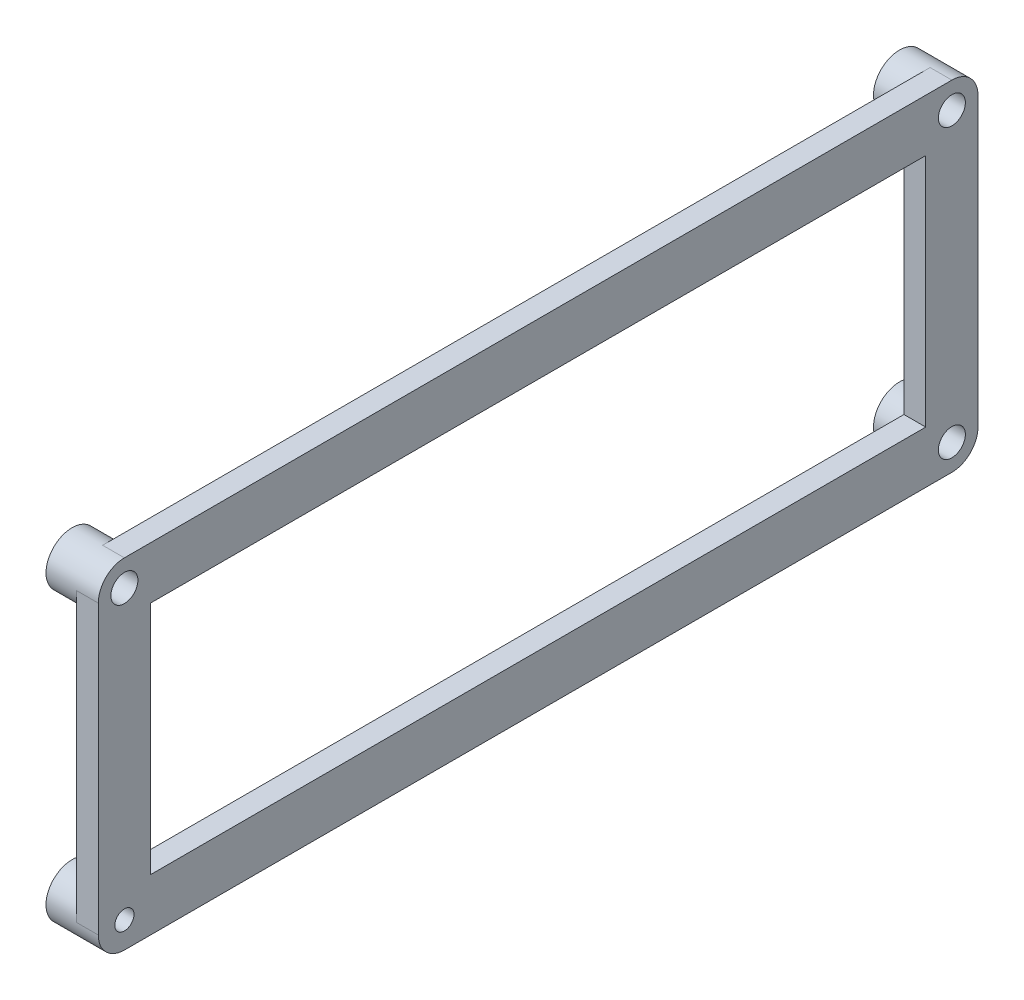
ISO-10303-21;
HEADER;
FILE_DESCRIPTION(('STEP AP214'),'2;1');
FILE_NAME('part.step','',(''),(''),'','','');
FILE_SCHEMA(('AUTOMOTIVE_DESIGN { 1 0 10303 214 1 1 1 1 }'));
ENDSEC;
DATA;
#1=APPLICATION_CONTEXT('core data for automotive mechanical design processes');
#2=APPLICATION_PROTOCOL_DEFINITION('international standard','automotive_design',2000,#1);
#3=PRODUCT_CONTEXT('',#1,'mechanical');
#4=PRODUCT('Part','Part','',(#3));
#5=PRODUCT_RELATED_PRODUCT_CATEGORY('part','',(#4));
#6=PRODUCT_DEFINITION_FORMATION('','',#4);
#7=PRODUCT_DEFINITION_CONTEXT('part definition',#1,'design');
#8=PRODUCT_DEFINITION('design','',#6,#7);
#9=PRODUCT_DEFINITION_SHAPE('','',#8);
#10=(LENGTH_UNIT() NAMED_UNIT(*) SI_UNIT(.MILLI.,.METRE.));
#11=(NAMED_UNIT(*) PLANE_ANGLE_UNIT() SI_UNIT($,.RADIAN.));
#12=(NAMED_UNIT(*) SI_UNIT($,.STERADIAN.) SOLID_ANGLE_UNIT());
#13=UNCERTAINTY_MEASURE_WITH_UNIT(LENGTH_MEASURE(1.E-05),#10,'distance_accuracy_value','');
#14=(GEOMETRIC_REPRESENTATION_CONTEXT(3) GLOBAL_UNCERTAINTY_ASSIGNED_CONTEXT((#13)) GLOBAL_UNIT_ASSIGNED_CONTEXT((#10,
#11,#12)) REPRESENTATION_CONTEXT('',''));
#15=CARTESIAN_POINT('',(0.,0.,0.));
#16=DIRECTION('',(0.,0.,1.));
#17=DIRECTION('',(1.,0.,0.));
#18=AXIS2_PLACEMENT_3D('',#15,#16,#17);
#19=CARTESIAN_POINT('',(6.,0.,0.));
#20=DIRECTION('',(1.,0.,0.));
#21=DIRECTION('',(0.,0.,-1.));
#22=AXIS2_PLACEMENT_3D('',#19,#20,#21);
#23=PLANE('',#22);
#24=DIRECTION('',(0.,0.,-1.));
#25=VECTOR('',#24,1.);
#26=CARTESIAN_POINT('',(6.,-13.5,0.));
#27=LINE('',#26,#25);
#28=CARTESIAN_POINT('',(6.,-13.5,44.5));
#29=VERTEX_POINT('',#28);
#30=CARTESIAN_POINT('',(6.,-13.5,-44.5));
#31=VERTEX_POINT('',#30);
#32=EDGE_CURVE('E134',#29,#31,#27,.T.);
#33=ORIENTED_EDGE('',*,*,#32,.F.);
#34=DIRECTION('',(0.,-1.,0.));
#35=VECTOR('',#34,1.);
#36=CARTESIAN_POINT('',(6.,0.,44.5));
#37=LINE('',#36,#35);
#38=CARTESIAN_POINT('',(6.,13.5,44.5));
#39=VERTEX_POINT('',#38);
#40=EDGE_CURVE('E124',#39,#29,#37,.T.);
#41=ORIENTED_EDGE('',*,*,#40,.F.);
#42=DIRECTION('',(0.,0.,-1.));
#43=VECTOR('',#42,1.);
#44=CARTESIAN_POINT('',(6.,13.5,0.));
#45=LINE('',#44,#43);
#46=CARTESIAN_POINT('',(6.,13.5,-44.5));
#47=VERTEX_POINT('',#46);
#48=EDGE_CURVE('E135',#39,#47,#45,.T.);
#49=ORIENTED_EDGE('',*,*,#48,.T.);
#50=DIRECTION('',(0.,-1.,0.));
#51=VECTOR('',#50,1.);
#52=CARTESIAN_POINT('',(6.,0.,-44.5));
#53=LINE('',#52,#51);
#54=EDGE_CURVE('E139',#47,#31,#53,.T.);
#55=ORIENTED_EDGE('',*,*,#54,.T.);
#56=EDGE_LOOP('',(#33,#41,#49,#55));
#57=FACE_BOUND('',#56,.T.);
#58=CARTESIAN_POINT('',(6.,16.5,47.5));
#59=DIRECTION('',(1.,0.,0.));
#60=DIRECTION('',(0.,0.,-1.));
#61=AXIS2_PLACEMENT_3D('',#58,#59,#60);
#62=CIRCLE('',#61,3.);
#63=CARTESIAN_POINT('',(6.,19.5,47.5));
#64=VERTEX_POINT('',#63);
#65=CARTESIAN_POINT('',(6.,16.5,50.5));
#66=VERTEX_POINT('',#65);
#67=EDGE_CURVE('E196',#64,#66,#62,.T.);
#68=ORIENTED_EDGE('',*,*,#67,.T.);
#69=DIRECTION('',(0.,-1.,0.));
#70=VECTOR('',#69,1.);
#71=CARTESIAN_POINT('',(6.,0.,50.5));
#72=LINE('',#71,#70);
#73=CARTESIAN_POINT('',(6.,-16.5,50.5));
#74=VERTEX_POINT('',#73);
#75=EDGE_CURVE('E142',#66,#74,#72,.T.);
#76=ORIENTED_EDGE('',*,*,#75,.T.);
#77=CARTESIAN_POINT('',(6.,-16.5,47.5));
#78=DIRECTION('',(1.,0.,0.));
#79=DIRECTION('',(0.,0.,-1.));
#80=AXIS2_PLACEMENT_3D('',#77,#78,#79);
#81=CIRCLE('',#80,3.);
#82=CARTESIAN_POINT('',(6.,-19.5,47.5));
#83=VERTEX_POINT('',#82);
#84=EDGE_CURVE('E168',#74,#83,#81,.T.);
#85=ORIENTED_EDGE('',*,*,#84,.T.);
#86=DIRECTION('',(0.,0.,-1.));
#87=VECTOR('',#86,1.);
#88=CARTESIAN_POINT('',(6.,-19.5,0.));
#89=LINE('',#88,#87);
#90=CARTESIAN_POINT('',(6.,-19.5,-47.5));
#91=VERTEX_POINT('',#90);
#92=EDGE_CURVE('E209',#83,#91,#89,.T.);
#93=ORIENTED_EDGE('',*,*,#92,.T.);
#94=CARTESIAN_POINT('',(6.,-16.5,-47.5));
#95=DIRECTION('',(1.,0.,0.));
#96=DIRECTION('',(0.,0.,-1.));
#97=AXIS2_PLACEMENT_3D('',#94,#95,#96);
#98=CIRCLE('',#97,3.);
#99=CARTESIAN_POINT('',(6.,-16.5,-50.5));
#100=VERTEX_POINT('',#99);
#101=EDGE_CURVE('E206',#91,#100,#98,.T.);
#102=ORIENTED_EDGE('',*,*,#101,.T.);
#103=DIRECTION('',(0.,-1.,0.));
#104=VECTOR('',#103,1.);
#105=CARTESIAN_POINT('',(6.,0.,-50.5));
#106=LINE('',#105,#104);
#107=CARTESIAN_POINT('',(6.,16.5,-50.5));
#108=VERTEX_POINT('',#107);
#109=EDGE_CURVE('E204',#108,#100,#106,.T.);
#110=ORIENTED_EDGE('',*,*,#109,.F.);
#111=CARTESIAN_POINT('',(6.,16.5,-47.5));
#112=DIRECTION('',(1.,0.,0.));
#113=DIRECTION('',(0.,0.,-1.));
#114=AXIS2_PLACEMENT_3D('',#111,#112,#113);
#115=CIRCLE('',#114,3.);
#116=CARTESIAN_POINT('',(6.,19.5,-47.5));
#117=VERTEX_POINT('',#116);
#118=EDGE_CURVE('E202',#108,#117,#115,.T.);
#119=ORIENTED_EDGE('',*,*,#118,.T.);
#120=DIRECTION('',(0.,0.,-1.));
#121=VECTOR('',#120,1.);
#122=CARTESIAN_POINT('',(6.,19.5,0.));
#123=LINE('',#122,#121);
#124=EDGE_CURVE('E199',#64,#117,#123,.T.);
#125=ORIENTED_EDGE('',*,*,#124,.F.);
#126=EDGE_LOOP('',(#68,#76,#85,#93,#102,#110,#119,#125));
#127=FACE_BOUND('',#126,.T.);
#128=CARTESIAN_POINT('',(6.,16.5,47.5));
#129=DIRECTION('',(1.,0.,0.));
#130=DIRECTION('',(0.,0.,-1.));
#131=AXIS2_PLACEMENT_3D('',#128,#129,#130);
#132=CIRCLE('',#131,1.55);
#133=CARTESIAN_POINT('',(6.,16.5,45.95));
#134=VERTEX_POINT('',#133);
#135=EDGE_CURVE('E190',#134,#134,#132,.F.);
#136=ORIENTED_EDGE('',*,*,#135,.T.);
#137=EDGE_LOOP('',(#136));
#138=FACE_BOUND('',#137,.T.);
#139=CARTESIAN_POINT('',(6.,16.5,-47.5));
#140=DIRECTION('',(1.,0.,0.));
#141=DIRECTION('',(0.,0.,-1.));
#142=AXIS2_PLACEMENT_3D('',#139,#140,#141);
#143=CIRCLE('',#142,1.55);
#144=CARTESIAN_POINT('',(6.,16.5,-49.05));
#145=VERTEX_POINT('',#144);
#146=EDGE_CURVE('E187',#145,#145,#143,.T.);
#147=ORIENTED_EDGE('',*,*,#146,.F.);
#148=EDGE_LOOP('',(#147));
#149=FACE_BOUND('',#148,.T.);
#150=CARTESIAN_POINT('',(6.,-16.5,-47.5));
#151=DIRECTION('',(1.,0.,0.));
#152=DIRECTION('',(0.,0.,-1.));
#153=AXIS2_PLACEMENT_3D('',#150,#151,#152);
#154=CIRCLE('',#153,1.55);
#155=CARTESIAN_POINT('',(6.,-16.5,-49.05));
#156=VERTEX_POINT('',#155);
#157=EDGE_CURVE('E184',#156,#156,#154,.T.);
#158=ORIENTED_EDGE('',*,*,#157,.F.);
#159=EDGE_LOOP('',(#158));
#160=FACE_BOUND('',#159,.T.);
#161=CARTESIAN_POINT('',(6.,-16.5,47.5));
#162=DIRECTION('',(1.,0.,0.));
#163=DIRECTION('',(0.,0.,-1.));
#164=AXIS2_PLACEMENT_3D('',#161,#162,#163);
#165=CIRCLE('',#164,1.1);
#166=CARTESIAN_POINT('',(6.,-16.5,46.4));
#167=VERTEX_POINT('',#166);
#168=EDGE_CURVE('E328',#167,#167,#165,.F.);
#169=ORIENTED_EDGE('',*,*,#168,.T.);
#170=EDGE_LOOP('',(#169));
#171=FACE_BOUND('',#170,.T.);
#172=ADVANCED_FACE('F36',(#57,#127,#138,#149,#160,#171),#23,.T.);
#173=CARTESIAN_POINT('',(6.,0.,50.5));
#174=DIRECTION('',(0.,0.,-1.));
#175=DIRECTION('',(-1.,0.,0.));
#176=AXIS2_PLACEMENT_3D('',#173,#174,#175);
#177=PLANE('',#176);
#178=ORIENTED_EDGE('',*,*,#75,.F.);
#179=DIRECTION('',(-1.,0.,0.));
#180=VECTOR('',#179,1.);
#181=CARTESIAN_POINT('',(6.,16.5,50.5));
#182=LINE('',#181,#180);
#183=CARTESIAN_POINT('',(3.5,16.5,50.5));
#184=VERTEX_POINT('',#183);
#185=EDGE_CURVE('E352',#66,#184,#182,.T.);
#186=ORIENTED_EDGE('',*,*,#185,.T.);
#187=DIRECTION('',(0.,-1.,0.));
#188=VECTOR('',#187,1.);
#189=CARTESIAN_POINT('',(3.5,0.,50.5));
#190=LINE('',#189,#188);
#191=CARTESIAN_POINT('',(3.5,-16.5,50.5));
#192=VERTEX_POINT('',#191);
#193=EDGE_CURVE('E174',#184,#192,#190,.T.);
#194=ORIENTED_EDGE('',*,*,#193,.T.);
#195=DIRECTION('',(-1.,0.,0.));
#196=VECTOR('',#195,1.);
#197=CARTESIAN_POINT('',(6.,-16.5,50.5));
#198=LINE('',#197,#196);
#199=EDGE_CURVE('E156',#74,#192,#198,.T.);
#200=ORIENTED_EDGE('',*,*,#199,.F.);
#201=EDGE_LOOP('',(#178,#186,#194,#200));
#202=FACE_BOUND('',#201,.T.);
#203=ADVANCED_FACE('F253',(#202),#177,.F.);
#204=CARTESIAN_POINT('',(6.,0.,44.5));
#205=DIRECTION('',(0.,0.,-1.));
#206=DIRECTION('',(-1.,0.,0.));
#207=AXIS2_PLACEMENT_3D('',#204,#205,#206);
#208=PLANE('',#207);
#209=ORIENTED_EDGE('',*,*,#40,.T.);
#210=DIRECTION('',(-1.,0.,0.));
#211=VECTOR('',#210,1.);
#212=CARTESIAN_POINT('',(6.,-13.5,44.5));
#213=LINE('',#212,#211);
#214=CARTESIAN_POINT('',(3.5,-13.5,44.5));
#215=VERTEX_POINT('',#214);
#216=EDGE_CURVE('E128',#29,#215,#213,.T.);
#217=ORIENTED_EDGE('',*,*,#216,.T.);
#218=DIRECTION('',(0.,-1.,0.));
#219=VECTOR('',#218,1.);
#220=CARTESIAN_POINT('',(3.5,0.,44.5));
#221=LINE('',#220,#219);
#222=CARTESIAN_POINT('',(3.5,13.5,44.5));
#223=VERTEX_POINT('',#222);
#224=EDGE_CURVE('E171',#223,#215,#221,.T.);
#225=ORIENTED_EDGE('',*,*,#224,.F.);
#226=DIRECTION('',(-1.,0.,0.));
#227=VECTOR('',#226,1.);
#228=CARTESIAN_POINT('',(6.,13.5,44.5));
#229=LINE('',#228,#227);
#230=EDGE_CURVE('E130',#39,#223,#229,.T.);
#231=ORIENTED_EDGE('',*,*,#230,.F.);
#232=EDGE_LOOP('',(#209,#217,#225,#231));
#233=FACE_BOUND('',#232,.T.);
#234=ADVANCED_FACE('F38',(#233),#208,.T.);
#235=CARTESIAN_POINT('',(6.,0.,-50.5));
#236=DIRECTION('',(0.,0.,-1.));
#237=DIRECTION('',(-1.,0.,0.));
#238=AXIS2_PLACEMENT_3D('',#235,#236,#237);
#239=PLANE('',#238);
#240=DIRECTION('',(-1.,0.,0.));
#241=VECTOR('',#240,1.);
#242=CARTESIAN_POINT('',(6.,16.5,-50.5));
#243=LINE('',#242,#241);
#244=CARTESIAN_POINT('',(3.5,16.5,-50.5));
#245=VERTEX_POINT('',#244);
#246=EDGE_CURVE('E345',#108,#245,#243,.T.);
#247=ORIENTED_EDGE('',*,*,#246,.F.);
#248=ORIENTED_EDGE('',*,*,#109,.T.);
#249=DIRECTION('',(-1.,0.,0.));
#250=VECTOR('',#249,1.);
#251=CARTESIAN_POINT('',(6.,-16.5,-50.5));
#252=LINE('',#251,#250);
#253=CARTESIAN_POINT('',(3.5,-16.5,-50.5));
#254=VERTEX_POINT('',#253);
#255=EDGE_CURVE('E342',#100,#254,#252,.T.);
#256=ORIENTED_EDGE('',*,*,#255,.T.);
#257=DIRECTION('',(0.,-1.,0.));
#258=VECTOR('',#257,1.);
#259=CARTESIAN_POINT('',(3.5,0.,-50.5));
#260=LINE('',#259,#258);
#261=EDGE_CURVE('E179',#245,#254,#260,.T.);
#262=ORIENTED_EDGE('',*,*,#261,.F.);
#263=EDGE_LOOP('',(#247,#248,#256,#262));
#264=FACE_BOUND('',#263,.T.);
#265=ADVANCED_FACE('F260',(#264),#239,.T.);
#266=CARTESIAN_POINT('',(6.,0.,-44.5));
#267=DIRECTION('',(0.,0.,-1.));
#268=DIRECTION('',(-1.,0.,0.));
#269=AXIS2_PLACEMENT_3D('',#266,#267,#268);
#270=PLANE('',#269);
#271=DIRECTION('',(-1.,0.,0.));
#272=VECTOR('',#271,1.);
#273=CARTESIAN_POINT('',(6.,-13.5,-44.5));
#274=LINE('',#273,#272);
#275=CARTESIAN_POINT('',(3.5,-13.5,-44.5));
#276=VERTEX_POINT('',#275);
#277=EDGE_CURVE('E161',#31,#276,#274,.T.);
#278=ORIENTED_EDGE('',*,*,#277,.F.);
#279=ORIENTED_EDGE('',*,*,#54,.F.);
#280=DIRECTION('',(-1.,0.,0.));
#281=VECTOR('',#280,1.);
#282=CARTESIAN_POINT('',(6.,13.5,-44.5));
#283=LINE('',#282,#281);
#284=CARTESIAN_POINT('',(3.5,13.5,-44.5));
#285=VERTEX_POINT('',#284);
#286=EDGE_CURVE('E150',#47,#285,#283,.T.);
#287=ORIENTED_EDGE('',*,*,#286,.T.);
#288=DIRECTION('',(0.,-1.,0.));
#289=VECTOR('',#288,1.);
#290=CARTESIAN_POINT('',(3.5,0.,-44.5));
#291=LINE('',#290,#289);
#292=EDGE_CURVE('E164',#285,#276,#291,.T.);
#293=ORIENTED_EDGE('',*,*,#292,.T.);
#294=EDGE_LOOP('',(#278,#279,#287,#293));
#295=FACE_BOUND('',#294,.T.);
#296=ADVANCED_FACE('F263',(#295),#270,.F.);
#297=CARTESIAN_POINT('',(3.5,0.,0.));
#298=DIRECTION('',(1.,0.,0.));
#299=DIRECTION('',(0.,0.,-1.));
#300=AXIS2_PLACEMENT_3D('',#297,#298,#299);
#301=PLANE('',#300);
#302=DIRECTION('',(0.,0.,-1.));
#303=VECTOR('',#302,1.);
#304=CARTESIAN_POINT('',(3.5,-13.5,0.));
#305=LINE('',#304,#303);
#306=EDGE_CURVE('E146',#215,#276,#305,.T.);
#307=ORIENTED_EDGE('',*,*,#306,.T.);
#308=ORIENTED_EDGE('',*,*,#292,.F.);
#309=DIRECTION('',(0.,0.,-1.));
#310=VECTOR('',#309,1.);
#311=CARTESIAN_POINT('',(3.5,13.5,0.));
#312=LINE('',#311,#310);
#313=EDGE_CURVE('E167',#223,#285,#312,.T.);
#314=ORIENTED_EDGE('',*,*,#313,.F.);
#315=ORIENTED_EDGE('',*,*,#224,.T.);
#316=EDGE_LOOP('',(#307,#308,#314,#315));
#317=FACE_BOUND('',#316,.T.);
#318=CARTESIAN_POINT('',(3.5,16.5,-47.5));
#319=DIRECTION('',(1.,0.,0.));
#320=DIRECTION('',(0.,0.,-1.));
#321=AXIS2_PLACEMENT_3D('',#318,#319,#320);
#322=CIRCLE('',#321,3.);
#323=CARTESIAN_POINT('',(3.5,19.5,-47.5));
#324=VERTEX_POINT('',#323);
#325=EDGE_CURVE('E51',#324,#245,#322,.T.);
#326=ORIENTED_EDGE('',*,*,#325,.T.);
#327=ORIENTED_EDGE('',*,*,#261,.T.);
#328=CARTESIAN_POINT('',(3.5,-16.5,-47.5));
#329=DIRECTION('',(1.,0.,0.));
#330=DIRECTION('',(0.,0.,-1.));
#331=AXIS2_PLACEMENT_3D('',#328,#329,#330);
#332=CIRCLE('',#331,3.);
#333=CARTESIAN_POINT('',(3.5,-19.5,-47.5));
#334=VERTEX_POINT('',#333);
#335=EDGE_CURVE('E57',#254,#334,#332,.T.);
#336=ORIENTED_EDGE('',*,*,#335,.T.);
#337=DIRECTION('',(0.,0.,-1.));
#338=VECTOR('',#337,1.);
#339=CARTESIAN_POINT('',(3.5,-19.5,0.));
#340=LINE('',#339,#338);
#341=CARTESIAN_POINT('',(3.5,-19.5,47.5));
#342=VERTEX_POINT('',#341);
#343=EDGE_CURVE('E181',#342,#334,#340,.T.);
#344=ORIENTED_EDGE('',*,*,#343,.F.);
#345=CARTESIAN_POINT('',(3.5,-16.5,47.5));
#346=DIRECTION('',(1.,0.,0.));
#347=DIRECTION('',(0.,0.,-1.));
#348=AXIS2_PLACEMENT_3D('',#345,#346,#347);
#349=CIRCLE('',#348,3.);
#350=EDGE_CURVE('E183',#342,#192,#349,.T.);
#351=ORIENTED_EDGE('',*,*,#350,.T.);
#352=ORIENTED_EDGE('',*,*,#193,.F.);
#353=CARTESIAN_POINT('',(3.5,16.5,47.5));
#354=DIRECTION('',(1.,0.,0.));
#355=DIRECTION('',(0.,0.,-1.));
#356=AXIS2_PLACEMENT_3D('',#353,#354,#355);
#357=CIRCLE('',#356,3.);
#358=CARTESIAN_POINT('',(3.5,19.5,47.5));
#359=VERTEX_POINT('',#358);
#360=EDGE_CURVE('E330',#184,#359,#357,.T.);
#361=ORIENTED_EDGE('',*,*,#360,.T.);
#362=DIRECTION('',(0.,0.,-1.));
#363=VECTOR('',#362,1.);
#364=CARTESIAN_POINT('',(3.5,19.5,0.));
#365=LINE('',#364,#363);
#366=EDGE_CURVE('E177',#359,#324,#365,.T.);
#367=ORIENTED_EDGE('',*,*,#366,.T.);
#368=EDGE_LOOP('',(#326,#327,#336,#344,#351,#352,#361,#367));
#369=FACE_BOUND('',#368,.T.);
#370=ADVANCED_FACE('F266',(#317,#369),#301,.F.);
#371=CARTESIAN_POINT('',(0.,16.5,47.5));
#372=DIRECTION('',(1.,0.,0.));
#373=DIRECTION('',(0.,0.,-1.));
#374=AXIS2_PLACEMENT_3D('',#371,#372,#373);
#375=PLANE('',#374);
#376=CARTESIAN_POINT('',(0.,16.5,47.5));
#377=DIRECTION('',(1.,0.,0.));
#378=DIRECTION('',(0.,0.,-1.));
#379=AXIS2_PLACEMENT_3D('',#376,#377,#378);
#380=CIRCLE('',#379,3.);
#381=CARTESIAN_POINT('',(0.,16.5,44.5));
#382=VERTEX_POINT('',#381);
#383=EDGE_CURVE('E153',#382,#382,#380,.T.);
#384=ORIENTED_EDGE('',*,*,#383,.F.);
#385=EDGE_LOOP('',(#384));
#386=FACE_BOUND('',#385,.T.);
#387=CARTESIAN_POINT('',(0.,16.5,47.5));
#388=DIRECTION('',(1.,0.,0.));
#389=DIRECTION('',(0.,0.,-1.));
#390=AXIS2_PLACEMENT_3D('',#387,#388,#389);
#391=CIRCLE('',#390,1.55);
#392=CARTESIAN_POINT('',(0.,16.5,45.95));
#393=VERTEX_POINT('',#392);
#394=EDGE_CURVE('E148',#393,#393,#391,.T.);
#395=ORIENTED_EDGE('',*,*,#394,.T.);
#396=EDGE_LOOP('',(#395));
#397=FACE_BOUND('',#396,.T.);
#398=ADVANCED_FACE('F275',(#386,#397),#375,.F.);
#399=CARTESIAN_POINT('',(3.5,16.5,47.5));
#400=DIRECTION('',(-1.,0.,0.));
#401=DIRECTION('',(0.,0.,1.));
#402=AXIS2_PLACEMENT_3D('',#399,#400,#401);
#403=CYLINDRICAL_SURFACE('',#402,3.);
#404=ORIENTED_EDGE('',*,*,#360,.F.);
#405=ORIENTED_EDGE('',*,*,#185,.F.);
#406=ORIENTED_EDGE('',*,*,#67,.F.);
#407=DIRECTION('',(-1.,0.,0.));
#408=VECTOR('',#407,1.);
#409=CARTESIAN_POINT('',(6.,19.5,47.5));
#410=LINE('',#409,#408);
#411=EDGE_CURVE('E350',#64,#359,#410,.T.);
#412=ORIENTED_EDGE('',*,*,#411,.T.);
#413=EDGE_LOOP('',(#404,#405,#406,#412));
#414=FACE_BOUND('',#413,.T.);
#415=ORIENTED_EDGE('',*,*,#383,.T.);
#416=EDGE_LOOP('',(#415));
#417=FACE_BOUND('',#416,.T.);
#418=ADVANCED_FACE('F280',(#414,#417),#403,.T.);
#419=CARTESIAN_POINT('',(3.5,16.5,47.5));
#420=DIRECTION('',(-1.,0.,0.));
#421=DIRECTION('',(0.,0.,1.));
#422=AXIS2_PLACEMENT_3D('',#419,#420,#421);
#423=CYLINDRICAL_SURFACE('',#422,1.55);
#424=ORIENTED_EDGE('',*,*,#394,.F.);
#425=EDGE_LOOP('',(#424));
#426=FACE_BOUND('',#425,.T.);
#427=ORIENTED_EDGE('',*,*,#135,.F.);
#428=EDGE_LOOP('',(#427));
#429=FACE_BOUND('',#428,.T.);
#430=ADVANCED_FACE('F296',(#426,#429),#423,.F.);
#431=CARTESIAN_POINT('',(6.,-13.5,0.));
#432=DIRECTION('',(0.,1.,0.));
#433=DIRECTION('',(0.,0.,1.));
#434=AXIS2_PLACEMENT_3D('',#431,#432,#433);
#435=PLANE('',#434);
#436=ORIENTED_EDGE('',*,*,#306,.F.);
#437=ORIENTED_EDGE('',*,*,#216,.F.);
#438=ORIENTED_EDGE('',*,*,#32,.T.);
#439=ORIENTED_EDGE('',*,*,#277,.T.);
#440=EDGE_LOOP('',(#436,#437,#438,#439));
#441=FACE_BOUND('',#440,.T.);
#442=ADVANCED_FACE('F144',(#441),#435,.T.);
#443=CARTESIAN_POINT('',(6.,13.5,0.));
#444=DIRECTION('',(0.,1.,0.));
#445=DIRECTION('',(0.,0.,1.));
#446=AXIS2_PLACEMENT_3D('',#443,#444,#445);
#447=PLANE('',#446);
#448=ORIENTED_EDGE('',*,*,#313,.T.);
#449=ORIENTED_EDGE('',*,*,#286,.F.);
#450=ORIENTED_EDGE('',*,*,#48,.F.);
#451=ORIENTED_EDGE('',*,*,#230,.T.);
#452=EDGE_LOOP('',(#448,#449,#450,#451));
#453=FACE_BOUND('',#452,.T.);
#454=ADVANCED_FACE('F286',(#453),#447,.F.);
#455=CARTESIAN_POINT('',(6.,-16.5,47.5));
#456=DIRECTION('',(-1.,0.,0.));
#457=DIRECTION('',(0.,0.,1.));
#458=AXIS2_PLACEMENT_3D('',#455,#456,#457);
#459=CYLINDRICAL_SURFACE('',#458,3.);
#460=ORIENTED_EDGE('',*,*,#199,.T.);
#461=ORIENTED_EDGE('',*,*,#350,.F.);
#462=DIRECTION('',(-1.,0.,0.));
#463=VECTOR('',#462,1.);
#464=CARTESIAN_POINT('',(6.,-19.5,47.5));
#465=LINE('',#464,#463);
#466=EDGE_CURVE('E163',#83,#342,#465,.T.);
#467=ORIENTED_EDGE('',*,*,#466,.F.);
#468=ORIENTED_EDGE('',*,*,#84,.F.);
#469=EDGE_LOOP('',(#460,#461,#467,#468));
#470=FACE_BOUND('',#469,.T.);
#471=CARTESIAN_POINT('',(0.,-16.5,47.5));
#472=DIRECTION('',(1.,0.,0.));
#473=DIRECTION('',(0.,0.,-1.));
#474=AXIS2_PLACEMENT_3D('',#471,#472,#473);
#475=CIRCLE('',#474,3.);
#476=CARTESIAN_POINT('',(0.,-16.5,44.5));
#477=VERTEX_POINT('',#476);
#478=EDGE_CURVE('E213',#477,#477,#475,.T.);
#479=ORIENTED_EDGE('',*,*,#478,.T.);
#480=EDGE_LOOP('',(#479));
#481=FACE_BOUND('',#480,.T.);
#482=ADVANCED_FACE('F288',(#470,#481),#459,.T.);
#483=CARTESIAN_POINT('',(6.,-19.5,0.));
#484=DIRECTION('',(0.,1.,0.));
#485=DIRECTION('',(0.,0.,1.));
#486=AXIS2_PLACEMENT_3D('',#483,#484,#485);
#487=PLANE('',#486);
#488=ORIENTED_EDGE('',*,*,#343,.T.);
#489=DIRECTION('',(-1.,0.,0.));
#490=VECTOR('',#489,1.);
#491=CARTESIAN_POINT('',(6.,-19.5,-47.5));
#492=LINE('',#491,#490);
#493=EDGE_CURVE('E339',#91,#334,#492,.T.);
#494=ORIENTED_EDGE('',*,*,#493,.F.);
#495=ORIENTED_EDGE('',*,*,#92,.F.);
#496=ORIENTED_EDGE('',*,*,#466,.T.);
#497=EDGE_LOOP('',(#488,#494,#495,#496));
#498=FACE_BOUND('',#497,.T.);
#499=ADVANCED_FACE('F293',(#498),#487,.F.);
#500=CARTESIAN_POINT('',(6.,-16.5,-47.5));
#501=DIRECTION('',(-1.,0.,0.));
#502=DIRECTION('',(0.,0.,1.));
#503=AXIS2_PLACEMENT_3D('',#500,#501,#502);
#504=CYLINDRICAL_SURFACE('',#503,3.);
#505=ORIENTED_EDGE('',*,*,#493,.T.);
#506=ORIENTED_EDGE('',*,*,#335,.F.);
#507=ORIENTED_EDGE('',*,*,#255,.F.);
#508=ORIENTED_EDGE('',*,*,#101,.F.);
#509=EDGE_LOOP('',(#505,#506,#507,#508));
#510=FACE_BOUND('',#509,.T.);
#511=CARTESIAN_POINT('',(0.,-16.5,-47.5));
#512=DIRECTION('',(1.,0.,0.));
#513=DIRECTION('',(0.,0.,-1.));
#514=AXIS2_PLACEMENT_3D('',#511,#512,#513);
#515=CIRCLE('',#514,3.);
#516=CARTESIAN_POINT('',(0.,-16.5,-50.5));
#517=VERTEX_POINT('',#516);
#518=EDGE_CURVE('E217',#517,#517,#515,.T.);
#519=ORIENTED_EDGE('',*,*,#518,.T.);
#520=EDGE_LOOP('',(#519));
#521=FACE_BOUND('',#520,.T.);
#522=ADVANCED_FACE('F304',(#510,#521),#504,.T.);
#523=CARTESIAN_POINT('',(6.,16.5,-47.5));
#524=DIRECTION('',(-1.,0.,0.));
#525=DIRECTION('',(0.,0.,1.));
#526=AXIS2_PLACEMENT_3D('',#523,#524,#525);
#527=CYLINDRICAL_SURFACE('',#526,3.);
#528=ORIENTED_EDGE('',*,*,#246,.T.);
#529=ORIENTED_EDGE('',*,*,#325,.F.);
#530=DIRECTION('',(-1.,0.,0.));
#531=VECTOR('',#530,1.);
#532=CARTESIAN_POINT('',(6.,19.5,-47.5));
#533=LINE('',#532,#531);
#534=EDGE_CURVE('E347',#117,#324,#533,.T.);
#535=ORIENTED_EDGE('',*,*,#534,.F.);
#536=ORIENTED_EDGE('',*,*,#118,.F.);
#537=EDGE_LOOP('',(#528,#529,#535,#536));
#538=FACE_BOUND('',#537,.T.);
#539=CARTESIAN_POINT('',(0.,16.5,-47.5));
#540=DIRECTION('',(1.,0.,0.));
#541=DIRECTION('',(0.,0.,-1.));
#542=AXIS2_PLACEMENT_3D('',#539,#540,#541);
#543=CIRCLE('',#542,3.);
#544=CARTESIAN_POINT('',(0.,16.5,-50.5));
#545=VERTEX_POINT('',#544);
#546=EDGE_CURVE('E44',#545,#545,#543,.T.);
#547=ORIENTED_EDGE('',*,*,#546,.T.);
#548=EDGE_LOOP('',(#547));
#549=FACE_BOUND('',#548,.T.);
#550=ADVANCED_FACE('F227',(#538,#549),#527,.T.);
#551=CARTESIAN_POINT('',(6.,19.5,0.));
#552=DIRECTION('',(0.,1.,0.));
#553=DIRECTION('',(0.,0.,1.));
#554=AXIS2_PLACEMENT_3D('',#551,#552,#553);
#555=PLANE('',#554);
#556=ORIENTED_EDGE('',*,*,#366,.F.);
#557=ORIENTED_EDGE('',*,*,#411,.F.);
#558=ORIENTED_EDGE('',*,*,#124,.T.);
#559=ORIENTED_EDGE('',*,*,#534,.T.);
#560=EDGE_LOOP('',(#556,#557,#558,#559));
#561=FACE_BOUND('',#560,.T.);
#562=ADVANCED_FACE('F249',(#561),#555,.T.);
#563=CARTESIAN_POINT('',(6.,-16.5,-47.5));
#564=DIRECTION('',(-1.,0.,0.));
#565=DIRECTION('',(0.,0.,1.));
#566=AXIS2_PLACEMENT_3D('',#563,#564,#565);
#567=CYLINDRICAL_SURFACE('',#566,1.55);
#568=ORIENTED_EDGE('',*,*,#157,.T.);
#569=EDGE_LOOP('',(#568));
#570=FACE_BOUND('',#569,.T.);
#571=CARTESIAN_POINT('',(0.,-16.5,-47.5));
#572=DIRECTION('',(1.,0.,0.));
#573=DIRECTION('',(0.,0.,-1.));
#574=AXIS2_PLACEMENT_3D('',#571,#572,#573);
#575=CIRCLE('',#574,1.55);
#576=CARTESIAN_POINT('',(0.,-16.5,-49.05));
#577=VERTEX_POINT('',#576);
#578=EDGE_CURVE('E220',#577,#577,#575,.T.);
#579=ORIENTED_EDGE('',*,*,#578,.F.);
#580=EDGE_LOOP('',(#579));
#581=FACE_BOUND('',#580,.T.);
#582=ADVANCED_FACE('F240',(#570,#581),#567,.F.);
#583=CARTESIAN_POINT('',(6.,16.5,-47.5));
#584=DIRECTION('',(-1.,0.,0.));
#585=DIRECTION('',(0.,0.,1.));
#586=AXIS2_PLACEMENT_3D('',#583,#584,#585);
#587=CYLINDRICAL_SURFACE('',#586,1.55);
#588=ORIENTED_EDGE('',*,*,#146,.T.);
#589=EDGE_LOOP('',(#588));
#590=FACE_BOUND('',#589,.T.);
#591=CARTESIAN_POINT('',(0.,16.5,-47.5));
#592=DIRECTION('',(1.,0.,0.));
#593=DIRECTION('',(0.,0.,-1.));
#594=AXIS2_PLACEMENT_3D('',#591,#592,#593);
#595=CIRCLE('',#594,1.55);
#596=CARTESIAN_POINT('',(0.,16.5,-49.05));
#597=VERTEX_POINT('',#596);
#598=EDGE_CURVE('E12',#597,#597,#595,.T.);
#599=ORIENTED_EDGE('',*,*,#598,.F.);
#600=EDGE_LOOP('',(#599));
#601=FACE_BOUND('',#600,.T.);
#602=ADVANCED_FACE('F237',(#590,#601),#587,.F.);
#603=CARTESIAN_POINT('',(0.,-16.5,47.5));
#604=DIRECTION('',(1.,0.,0.));
#605=DIRECTION('',(0.,0.,-1.));
#606=AXIS2_PLACEMENT_3D('',#603,#604,#605);
#607=PLANE('',#606);
#608=ORIENTED_EDGE('',*,*,#478,.F.);
#609=EDGE_LOOP('',(#608));
#610=FACE_BOUND('',#609,.T.);
#611=CARTESIAN_POINT('',(0.,-16.5,47.5));
#612=DIRECTION('',(-1.,0.,0.));
#613=DIRECTION('',(0.,0.,1.));
#614=AXIS2_PLACEMENT_3D('',#611,#612,#613);
#615=CIRCLE('',#614,1.1);
#616=CARTESIAN_POINT('',(0.,-16.5,48.6));
#617=VERTEX_POINT('',#616);
#618=EDGE_CURVE('E325',#617,#617,#615,.T.);
#619=ORIENTED_EDGE('',*,*,#618,.F.);
#620=EDGE_LOOP('',(#619));
#621=FACE_BOUND('',#620,.T.);
#622=ADVANCED_FACE('F239',(#610,#621),#607,.F.);
#623=CARTESIAN_POINT('',(0.,-16.5,-47.5));
#624=DIRECTION('',(1.,0.,0.));
#625=DIRECTION('',(0.,0.,-1.));
#626=AXIS2_PLACEMENT_3D('',#623,#624,#625);
#627=PLANE('',#626);
#628=ORIENTED_EDGE('',*,*,#518,.F.);
#629=EDGE_LOOP('',(#628));
#630=FACE_BOUND('',#629,.T.);
#631=ORIENTED_EDGE('',*,*,#578,.T.);
#632=EDGE_LOOP('',(#631));
#633=FACE_BOUND('',#632,.T.);
#634=ADVANCED_FACE('F233',(#630,#633),#627,.F.);
#635=CARTESIAN_POINT('',(0.,16.5,-47.5));
#636=DIRECTION('',(1.,0.,0.));
#637=DIRECTION('',(0.,0.,-1.));
#638=AXIS2_PLACEMENT_3D('',#635,#636,#637);
#639=PLANE('',#638);
#640=ORIENTED_EDGE('',*,*,#546,.F.);
#641=EDGE_LOOP('',(#640));
#642=FACE_BOUND('',#641,.T.);
#643=ORIENTED_EDGE('',*,*,#598,.T.);
#644=EDGE_LOOP('',(#643));
#645=FACE_BOUND('',#644,.T.);
#646=ADVANCED_FACE('F229',(#642,#645),#639,.F.);
#647=CARTESIAN_POINT('',(10.3840620433566,-16.5,47.5));
#648=DIRECTION('',(-1.,0.,0.));
#649=DIRECTION('',(0.,0.,1.));
#650=AXIS2_PLACEMENT_3D('',#647,#648,#649);
#651=CYLINDRICAL_SURFACE('',#650,1.1);
#652=ORIENTED_EDGE('',*,*,#618,.T.);
#653=EDGE_LOOP('',(#652));
#654=FACE_BOUND('',#653,.T.);
#655=ORIENTED_EDGE('',*,*,#168,.F.);
#656=EDGE_LOOP('',(#655));
#657=FACE_BOUND('',#656,.T.);
#658=ADVANCED_FACE('F232',(#654,#657),#651,.F.);
#659=CLOSED_SHELL('',(#172,#203,#234,#265,#296,#370,#398,#418,#430,#442,#454,#482,#499,#522,
#550,#562,#582,#602,#622,#634,#646,#658));
#660=MANIFOLD_SOLID_BREP('B2',#659);
#661=ADVANCED_BREP_SHAPE_REPRESENTATION('',(#18,#660),#14);
#662=SHAPE_DEFINITION_REPRESENTATION(#9,#661);
ENDSEC;
END-ISO-10303-21;
